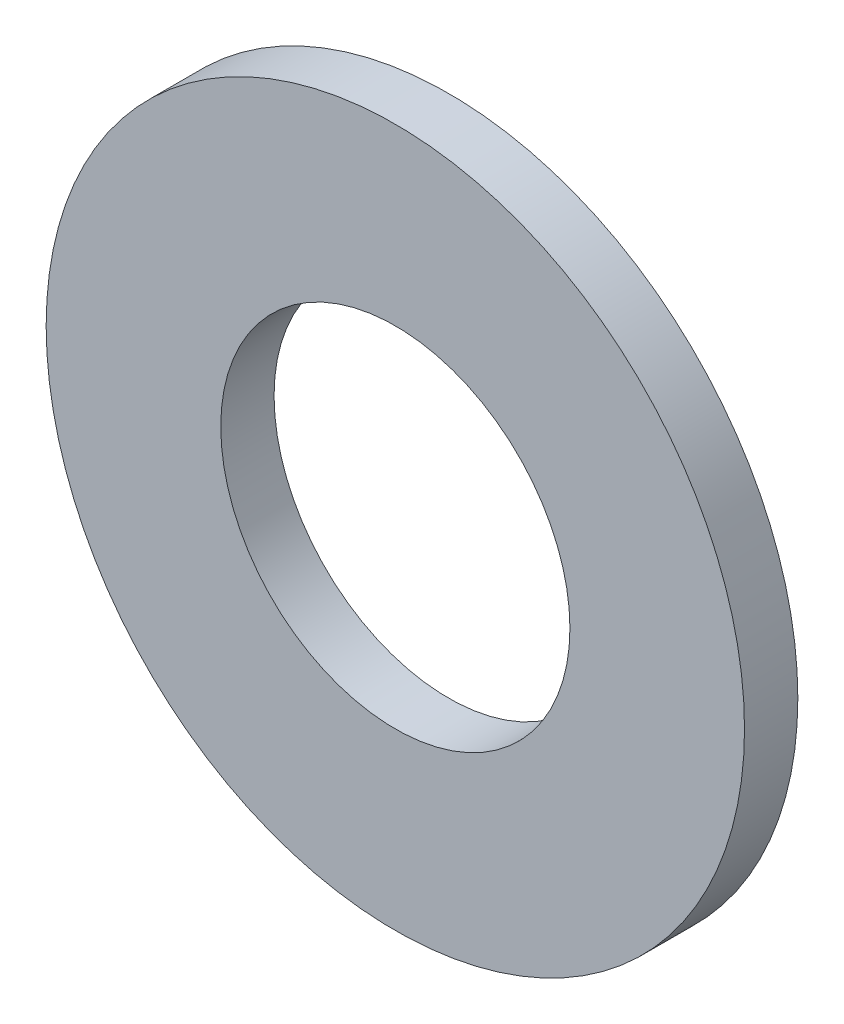
ISO-10303-21;
HEADER;
FILE_DESCRIPTION(('STEP AP214'),'2;1');
FILE_NAME('part.step','',(''),(''),'','','');
FILE_SCHEMA(('AUTOMOTIVE_DESIGN { 1 0 10303 214 1 1 1 1 }'));
ENDSEC;
DATA;
#1=APPLICATION_CONTEXT('core data for automotive mechanical design processes');
#2=APPLICATION_PROTOCOL_DEFINITION('international standard','automotive_design',2000,#1);
#3=PRODUCT_CONTEXT('',#1,'mechanical');
#4=PRODUCT('Part','Part','',(#3));
#5=PRODUCT_RELATED_PRODUCT_CATEGORY('part','',(#4));
#6=PRODUCT_DEFINITION_FORMATION('','',#4);
#7=PRODUCT_DEFINITION_CONTEXT('part definition',#1,'design');
#8=PRODUCT_DEFINITION('design','',#6,#7);
#9=PRODUCT_DEFINITION_SHAPE('','',#8);
#10=(LENGTH_UNIT() NAMED_UNIT(*) SI_UNIT(.MILLI.,.METRE.));
#11=(NAMED_UNIT(*) PLANE_ANGLE_UNIT() SI_UNIT($,.RADIAN.));
#12=(NAMED_UNIT(*) SI_UNIT($,.STERADIAN.) SOLID_ANGLE_UNIT());
#13=UNCERTAINTY_MEASURE_WITH_UNIT(LENGTH_MEASURE(1.E-05),#10,'distance_accuracy_value','');
#14=(GEOMETRIC_REPRESENTATION_CONTEXT(3) GLOBAL_UNCERTAINTY_ASSIGNED_CONTEXT((#13)) GLOBAL_UNIT_ASSIGNED_CONTEXT((#10,
#11,#12)) REPRESENTATION_CONTEXT('',''));
#15=CARTESIAN_POINT('',(0.,0.,0.));
#16=DIRECTION('',(0.,0.,1.));
#17=DIRECTION('',(1.,0.,0.));
#18=AXIS2_PLACEMENT_3D('',#15,#16,#17);
#19=CARTESIAN_POINT('',(0.937490909090911,0.,0.));
#20=DIRECTION('',(0.,0.,1.));
#21=DIRECTION('',(1.,0.,0.));
#22=AXIS2_PLACEMENT_3D('',#19,#20,#21);
#23=PLANE('',#22);
#24=CARTESIAN_POINT('',(0.,0.,0.));
#25=DIRECTION('',(0.,0.,1.));
#26=DIRECTION('',(1.,0.,0.));
#27=AXIS2_PLACEMENT_3D('',#24,#25,#26);
#28=CIRCLE('',#27,5.1562);
#29=CARTESIAN_POINT('',(5.1562,0.,0.));
#30=VERTEX_POINT('',#29);
#31=EDGE_CURVE('E27',#30,#30,#28,.T.);
#32=ORIENTED_EDGE('',*,*,#31,.T.);
#33=EDGE_LOOP('',(#32));
#34=FACE_BOUND('',#33,.T.);
#35=CARTESIAN_POINT('',(0.,0.,0.));
#36=DIRECTION('',(0.,0.,1.));
#37=DIRECTION('',(1.,0.,0.));
#38=AXIS2_PLACEMENT_3D('',#35,#36,#37);
#39=CIRCLE('',#38,10.3124);
#40=CARTESIAN_POINT('',(10.3124,0.,0.));
#41=VERTEX_POINT('',#40);
#42=EDGE_CURVE('E18',#41,#41,#39,.T.);
#43=ORIENTED_EDGE('',*,*,#42,.F.);
#44=EDGE_LOOP('',(#43));
#45=FACE_BOUND('',#44,.T.);
#46=ADVANCED_FACE('F15',(#34,#45),#23,.F.);
#47=CARTESIAN_POINT('',(0.,0.,0.));
#48=DIRECTION('',(0.,0.,1.));
#49=DIRECTION('',(1.,0.,0.));
#50=AXIS2_PLACEMENT_3D('',#47,#48,#49);
#51=CYLINDRICAL_SURFACE('',#50,10.3124);
#52=CARTESIAN_POINT('',(0.,0.,1.5748));
#53=DIRECTION('',(0.,0.,1.));
#54=DIRECTION('',(1.,0.,0.));
#55=AXIS2_PLACEMENT_3D('',#52,#53,#54);
#56=CIRCLE('',#55,10.3124);
#57=CARTESIAN_POINT('',(10.3124,0.,1.5748));
#58=VERTEX_POINT('',#57);
#59=EDGE_CURVE('E22',#58,#58,#56,.T.);
#60=ORIENTED_EDGE('',*,*,#59,.F.);
#61=EDGE_LOOP('',(#60));
#62=FACE_BOUND('',#61,.T.);
#63=ORIENTED_EDGE('',*,*,#42,.T.);
#64=EDGE_LOOP('',(#63));
#65=FACE_BOUND('',#64,.T.);
#66=ADVANCED_FACE('F35',(#62,#65),#51,.T.);
#67=CARTESIAN_POINT('',(0.,0.,0.));
#68=DIRECTION('',(0.,0.,1.));
#69=DIRECTION('',(1.,0.,0.));
#70=AXIS2_PLACEMENT_3D('',#67,#68,#69);
#71=CYLINDRICAL_SURFACE('',#70,5.1562);
#72=ORIENTED_EDGE('',*,*,#31,.F.);
#73=EDGE_LOOP('',(#72));
#74=FACE_BOUND('',#73,.T.);
#75=CARTESIAN_POINT('',(0.,0.,1.5748));
#76=DIRECTION('',(0.,0.,1.));
#77=DIRECTION('',(1.,0.,0.));
#78=AXIS2_PLACEMENT_3D('',#75,#76,#77);
#79=CIRCLE('',#78,5.1562);
#80=CARTESIAN_POINT('',(5.1562,0.,1.5748));
#81=VERTEX_POINT('',#80);
#82=EDGE_CURVE('E10',#81,#81,#79,.F.);
#83=ORIENTED_EDGE('',*,*,#82,.F.);
#84=EDGE_LOOP('',(#83));
#85=FACE_BOUND('',#84,.T.);
#86=ADVANCED_FACE('F42',(#74,#85),#71,.F.);
#87=CARTESIAN_POINT('',(0.937490909090911,0.,1.5748));
#88=DIRECTION('',(0.,0.,1.));
#89=DIRECTION('',(1.,0.,0.));
#90=AXIS2_PLACEMENT_3D('',#87,#88,#89);
#91=PLANE('',#90);
#92=ORIENTED_EDGE('',*,*,#82,.T.);
#93=EDGE_LOOP('',(#92));
#94=FACE_BOUND('',#93,.T.);
#95=ORIENTED_EDGE('',*,*,#59,.T.);
#96=EDGE_LOOP('',(#95));
#97=FACE_BOUND('',#96,.T.);
#98=ADVANCED_FACE('F44',(#94,#97),#91,.T.);
#99=CLOSED_SHELL('',(#46,#66,#86,#98));
#100=MANIFOLD_SOLID_BREP('B1',#99);
#101=ADVANCED_BREP_SHAPE_REPRESENTATION('',(#18,#100),#14);
#102=SHAPE_DEFINITION_REPRESENTATION(#9,#101);
ENDSEC;
END-ISO-10303-21;
